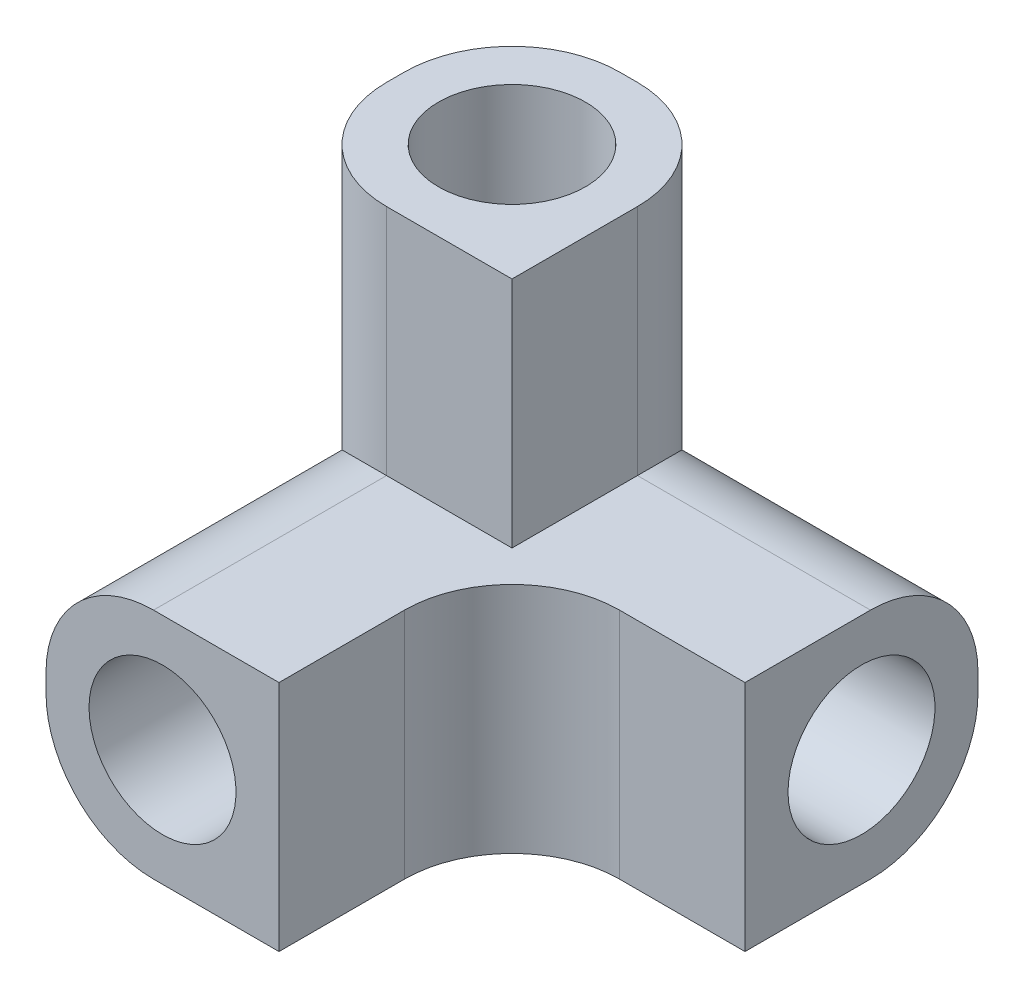
ISO-10303-21;
HEADER;
FILE_DESCRIPTION(('STEP AP214'),'2;1');
FILE_NAME('part.step','',(''),(''),'','','');
FILE_SCHEMA(('AUTOMOTIVE_DESIGN { 1 0 10303 214 1 1 1 1 }'));
ENDSEC;
DATA;
#1=APPLICATION_CONTEXT('core data for automotive mechanical design processes');
#2=APPLICATION_PROTOCOL_DEFINITION('international standard','automotive_design',2000,#1);
#3=PRODUCT_CONTEXT('',#1,'mechanical');
#4=PRODUCT('Part','Part','',(#3));
#5=PRODUCT_RELATED_PRODUCT_CATEGORY('part','',(#4));
#6=PRODUCT_DEFINITION_FORMATION('','',#4);
#7=PRODUCT_DEFINITION_CONTEXT('part definition',#1,'design');
#8=PRODUCT_DEFINITION('design','',#6,#7);
#9=PRODUCT_DEFINITION_SHAPE('','',#8);
#10=(LENGTH_UNIT() NAMED_UNIT(*) SI_UNIT(.MILLI.,.METRE.));
#11=(NAMED_UNIT(*) PLANE_ANGLE_UNIT() SI_UNIT($,.RADIAN.));
#12=(NAMED_UNIT(*) SI_UNIT($,.STERADIAN.) SOLID_ANGLE_UNIT());
#13=UNCERTAINTY_MEASURE_WITH_UNIT(LENGTH_MEASURE(1.E-05),#10,'distance_accuracy_value','');
#14=(GEOMETRIC_REPRESENTATION_CONTEXT(3) GLOBAL_UNCERTAINTY_ASSIGNED_CONTEXT((#13)) GLOBAL_UNIT_ASSIGNED_CONTEXT((#10,
#11,#12)) REPRESENTATION_CONTEXT('',''));
#15=CARTESIAN_POINT('',(0.,0.,0.));
#16=DIRECTION('',(0.,0.,1.));
#17=DIRECTION('',(1.,0.,0.));
#18=AXIS2_PLACEMENT_3D('',#15,#16,#17);
#19=CARTESIAN_POINT('',(-5.33069470301595,8.03212896370819,6.5));
#20=DIRECTION('',(-1.,0.,0.));
#21=DIRECTION('',(0.,-1.,0.));
#22=AXIS2_PLACEMENT_3D('',#19,#20,#21);
#23=PLANE('',#22);
#24=DIRECTION('',(0.,0.,-1.));
#25=VECTOR('',#24,1.);
#26=CARTESIAN_POINT('',(-5.33069470301595,1.53212896370819,6.5));
#27=LINE('',#26,#25);
#28=CARTESIAN_POINT('',(-5.33069470301595,1.53212896370819,6.5));
#29=VERTEX_POINT('',#28);
#30=CARTESIAN_POINT('',(-5.33069470301595,1.53212896370819,3.));
#31=VERTEX_POINT('',#30);
#32=EDGE_CURVE('E200',#29,#31,#27,.T.);
#33=ORIENTED_EDGE('',*,*,#32,.T.);
#34=DIRECTION('',(0.,-1.,0.));
#35=VECTOR('',#34,1.);
#36=CARTESIAN_POINT('',(-5.33069470301595,8.03212896370819,3.));
#37=LINE('',#36,#35);
#38=CARTESIAN_POINT('',(-5.33069470301595,8.03212896370819,3.));
#39=VERTEX_POINT('',#38);
#40=EDGE_CURVE('E267',#31,#39,#37,.F.);
#41=ORIENTED_EDGE('',*,*,#40,.T.);
#42=DIRECTION('',(0.,0.,-1.));
#43=VECTOR('',#42,1.);
#44=CARTESIAN_POINT('',(-5.33069470301595,8.03212896370819,6.5));
#45=LINE('',#44,#43);
#46=CARTESIAN_POINT('',(-5.33069470301595,8.03212896370819,6.5));
#47=VERTEX_POINT('',#46);
#48=EDGE_CURVE('E204',#47,#39,#45,.T.);
#49=ORIENTED_EDGE('',*,*,#48,.F.);
#50=DIRECTION('',(0.,1.,0.));
#51=VECTOR('',#50,1.);
#52=CARTESIAN_POINT('',(-5.33069470301595,8.03212896370819,6.5));
#53=LINE('',#52,#51);
#54=EDGE_CURVE('E189',#29,#47,#53,.T.);
#55=ORIENTED_EDGE('',*,*,#54,.F.);
#56=EDGE_LOOP('',(#33,#41,#49,#55));
#57=FACE_BOUND('',#56,.T.);
#58=ADVANCED_FACE('F33',(#57),#23,.F.);
#59=CARTESIAN_POINT('',(0.,0.,6.5));
#60=DIRECTION('',(0.,0.,1.));
#61=DIRECTION('',(1.,0.,0.));
#62=AXIS2_PLACEMENT_3D('',#59,#60,#61);
#63=PLANE('',#62);
#64=DIRECTION('',(-1.,0.,0.));
#65=VECTOR('',#64,1.);
#66=CARTESIAN_POINT('',(-11.830694703016,8.03212896370819,6.5));
#67=LINE('',#66,#65);
#68=CARTESIAN_POINT('',(-8.83069470301595,8.03212896370819,6.5));
#69=VERTEX_POINT('',#68);
#70=EDGE_CURVE('E192',#47,#69,#67,.T.);
#71=ORIENTED_EDGE('',*,*,#70,.T.);
#72=CARTESIAN_POINT('',(-8.83069470301595,5.03212896370819,6.5));
#73=DIRECTION('',(0.,0.,1.));
#74=DIRECTION('',(1.,0.,0.));
#75=AXIS2_PLACEMENT_3D('',#72,#73,#74);
#76=CIRCLE('',#75,3.);
#77=CARTESIAN_POINT('',(-11.830694703016,5.03212896370819,6.5));
#78=VERTEX_POINT('',#77);
#79=EDGE_CURVE('E239',#69,#78,#76,.T.);
#80=ORIENTED_EDGE('',*,*,#79,.T.);
#81=DIRECTION('',(0.,-1.,0.));
#82=VECTOR('',#81,1.);
#83=CARTESIAN_POINT('',(-11.830694703016,8.03212896370819,6.5));
#84=LINE('',#83,#82);
#85=CARTESIAN_POINT('',(-11.830694703016,4.53212896370819,6.5));
#86=VERTEX_POINT('',#85);
#87=EDGE_CURVE('E195',#78,#86,#84,.T.);
#88=ORIENTED_EDGE('',*,*,#87,.T.);
#89=CARTESIAN_POINT('',(-8.83069470301595,4.53212896370819,6.5));
#90=DIRECTION('',(0.,0.,1.));
#91=DIRECTION('',(1.,0.,0.));
#92=AXIS2_PLACEMENT_3D('',#89,#90,#91);
#93=CIRCLE('',#92,3.);
#94=CARTESIAN_POINT('',(-8.83069470301595,1.53212896370819,6.5));
#95=VERTEX_POINT('',#94);
#96=EDGE_CURVE('E237',#86,#95,#93,.T.);
#97=ORIENTED_EDGE('',*,*,#96,.T.);
#98=DIRECTION('',(1.,0.,0.));
#99=VECTOR('',#98,1.);
#100=CARTESIAN_POINT('',(-11.830694703016,1.53212896370819,6.5));
#101=LINE('',#100,#99);
#102=EDGE_CURVE('E198',#95,#29,#101,.T.);
#103=ORIENTED_EDGE('',*,*,#102,.T.);
#104=ORIENTED_EDGE('',*,*,#54,.T.);
#105=EDGE_LOOP('',(#71,#80,#88,#97,#103,#104));
#106=FACE_BOUND('',#105,.T.);
#107=CARTESIAN_POINT('',(-8.58069470301595,4.78212896370819,6.5));
#108=DIRECTION('',(0.,0.,1.));
#109=DIRECTION('',(1.,0.,0.));
#110=AXIS2_PLACEMENT_3D('',#107,#108,#109);
#111=CIRCLE('',#110,2.05);
#112=CARTESIAN_POINT('',(-10.6306947030159,4.78212896370819,6.5));
#113=VERTEX_POINT('',#112);
#114=EDGE_CURVE('E183',#113,#113,#111,.T.);
#115=ORIENTED_EDGE('',*,*,#114,.F.);
#116=EDGE_LOOP('',(#115));
#117=FACE_BOUND('',#116,.T.);
#118=ADVANCED_FACE('F285',(#106,#117),#63,.T.);
#119=DIRECTION('',(0.,0.,1.));
#120=VECTOR('',#119,1.);
#121=CARTESIAN_POINT('',(-5.33069470301595,8.03212896370819,0.));
#122=LINE('',#121,#120);
#123=CARTESIAN_POINT('',(-5.33069470301595,8.03212896370819,-3.5));
#124=VERTEX_POINT('',#123);
#125=CARTESIAN_POINT('',(-5.33069470301595,8.03212896370819,0.));
#126=VERTEX_POINT('',#125);
#127=EDGE_CURVE('E159',#124,#126,#122,.T.);
#128=ORIENTED_EDGE('',*,*,#127,.F.);
#129=DIRECTION('',(0.,1.,0.));
#130=VECTOR('',#129,1.);
#131=CARTESIAN_POINT('',(-5.33069470301595,14.5321289637082,-3.5));
#132=LINE('',#131,#130);
#133=CARTESIAN_POINT('',(-5.33069470301595,14.5321289637082,-3.5));
#134=VERTEX_POINT('',#133);
#135=EDGE_CURVE('E207',#124,#134,#132,.T.);
#136=ORIENTED_EDGE('',*,*,#135,.T.);
#137=DIRECTION('',(0.,0.,1.));
#138=VECTOR('',#137,1.);
#139=CARTESIAN_POINT('',(-5.33069470301595,14.5321289637082,0.));
#140=LINE('',#139,#138);
#141=CARTESIAN_POINT('',(-5.33069470301595,14.5321289637082,0.));
#142=VERTEX_POINT('',#141);
#143=EDGE_CURVE('E167',#134,#142,#140,.T.);
#144=ORIENTED_EDGE('',*,*,#143,.T.);
#145=DIRECTION('',(0.,-1.,0.));
#146=VECTOR('',#145,1.);
#147=CARTESIAN_POINT('',(-5.33069470301595,1.53212896370819,0.));
#148=LINE('',#147,#146);
#149=EDGE_CURVE('E164',#142,#126,#148,.T.);
#150=ORIENTED_EDGE('',*,*,#149,.T.);
#151=EDGE_LOOP('',(#128,#136,#144,#150));
#152=FACE_BOUND('',#151,.T.);
#153=ADVANCED_FACE('F288',(#152),#23,.F.);
#154=CARTESIAN_POINT('',(-11.830694703016,8.03212896370819,6.5));
#155=DIRECTION('',(0.,-1.,0.));
#156=DIRECTION('',(0.,0.,-1.));
#157=AXIS2_PLACEMENT_3D('',#154,#155,#156);
#158=PLANE('',#157);
#159=DIRECTION('',(-1.,0.,0.));
#160=VECTOR('',#159,1.);
#161=CARTESIAN_POINT('',(-11.830694703016,8.03212896370819,0.));
#162=LINE('',#161,#160);
#163=CARTESIAN_POINT('',(-8.83069470301595,8.03212896370819,0.));
#164=VERTEX_POINT('',#163);
#165=EDGE_CURVE('E186',#126,#164,#162,.T.);
#166=ORIENTED_EDGE('',*,*,#165,.T.);
#167=DIRECTION('',(0.,0.,-1.));
#168=VECTOR('',#167,1.);
#169=CARTESIAN_POINT('',(-8.83069470301595,8.03212896370819,6.5));
#170=LINE('',#169,#168);
#171=EDGE_CURVE('E235',#164,#69,#170,.F.);
#172=ORIENTED_EDGE('',*,*,#171,.T.);
#173=ORIENTED_EDGE('',*,*,#70,.F.);
#174=ORIENTED_EDGE('',*,*,#48,.T.);
#175=CARTESIAN_POINT('',(-2.33069470301595,8.03212896370819,3.));
#176=DIRECTION('',(0.,-1.,0.));
#177=DIRECTION('',(0.,0.,-1.));
#178=AXIS2_PLACEMENT_3D('',#175,#176,#177);
#179=CIRCLE('',#178,3.);
#180=CARTESIAN_POINT('',(-2.33069470301595,8.03212896370819,0.));
#181=VERTEX_POINT('',#180);
#182=EDGE_CURVE('E11',#39,#181,#179,.T.);
#183=ORIENTED_EDGE('',*,*,#182,.T.);
#184=DIRECTION('',(-1.,0.,0.));
#185=VECTOR('',#184,1.);
#186=CARTESIAN_POINT('',(1.16930529698405,8.03212896370819,0.));
#187=LINE('',#186,#185);
#188=CARTESIAN_POINT('',(1.16930529698405,8.03212896370819,0.));
#189=VERTEX_POINT('',#188);
#190=EDGE_CURVE('E48',#189,#181,#187,.T.);
#191=ORIENTED_EDGE('',*,*,#190,.F.);
#192=DIRECTION('',(0.,0.,1.));
#193=VECTOR('',#192,1.);
#194=CARTESIAN_POINT('',(1.16930529698405,8.03212896370819,0.));
#195=LINE('',#194,#193);
#196=CARTESIAN_POINT('',(1.16930529698405,8.03212896370819,-3.5));
#197=VERTEX_POINT('',#196);
#198=EDGE_CURVE('E158',#197,#189,#195,.T.);
#199=ORIENTED_EDGE('',*,*,#198,.F.);
#200=DIRECTION('',(-1.,0.,0.));
#201=VECTOR('',#200,1.);
#202=CARTESIAN_POINT('',(-5.33069470301595,8.03212896370819,-3.5));
#203=LINE('',#202,#201);
#204=EDGE_CURVE('E241',#197,#124,#203,.T.);
#205=ORIENTED_EDGE('',*,*,#204,.T.);
#206=ORIENTED_EDGE('',*,*,#127,.T.);
#207=EDGE_LOOP('',(#166,#172,#173,#174,#183,#191,#199,#205,#206));
#208=FACE_BOUND('',#207,.T.);
#209=ADVANCED_FACE('F275',(#208),#158,.F.);
#210=CARTESIAN_POINT('',(-11.830694703016,8.03212896370819,6.5));
#211=DIRECTION('',(1.,0.,0.));
#212=DIRECTION('',(0.,0.,-1.));
#213=AXIS2_PLACEMENT_3D('',#210,#211,#212);
#214=PLANE('',#213);
#215=DIRECTION('',(0.,0.,-1.));
#216=VECTOR('',#215,1.);
#217=CARTESIAN_POINT('',(-11.830694703016,5.03212896370819,6.5));
#218=LINE('',#217,#216);
#219=CARTESIAN_POINT('',(-11.830694703016,5.03212896370819,-3.));
#220=VERTEX_POINT('',#219);
#221=EDGE_CURVE('E228',#78,#220,#218,.T.);
#222=ORIENTED_EDGE('',*,*,#221,.T.);
#223=DIRECTION('',(0.,1.,0.));
#224=VECTOR('',#223,1.);
#225=CARTESIAN_POINT('',(-11.830694703016,14.5321289637082,-3.));
#226=LINE('',#225,#224);
#227=CARTESIAN_POINT('',(-11.830694703016,14.5321289637082,-3.));
#228=VERTEX_POINT('',#227);
#229=EDGE_CURVE('E230',#220,#228,#226,.T.);
#230=ORIENTED_EDGE('',*,*,#229,.T.);
#231=DIRECTION('',(0.,0.,-1.));
#232=VECTOR('',#231,1.);
#233=CARTESIAN_POINT('',(-11.830694703016,14.5321289637082,0.));
#234=LINE('',#233,#232);
#235=CARTESIAN_POINT('',(-11.830694703016,14.5321289637082,-3.5));
#236=VERTEX_POINT('',#235);
#237=EDGE_CURVE('E172',#228,#236,#234,.T.);
#238=ORIENTED_EDGE('',*,*,#237,.T.);
#239=DIRECTION('',(0.,-1.,0.));
#240=VECTOR('',#239,1.);
#241=CARTESIAN_POINT('',(-11.830694703016,1.53212896370819,-3.5));
#242=LINE('',#241,#240);
#243=CARTESIAN_POINT('',(-11.830694703016,4.53212896370819,-3.5));
#244=VERTEX_POINT('',#243);
#245=EDGE_CURVE('E224',#236,#244,#242,.T.);
#246=ORIENTED_EDGE('',*,*,#245,.T.);
#247=DIRECTION('',(0.,0.,-1.));
#248=VECTOR('',#247,1.);
#249=CARTESIAN_POINT('',(-11.830694703016,4.53212896370819,6.5));
#250=LINE('',#249,#248);
#251=EDGE_CURVE('E226',#244,#86,#250,.F.);
#252=ORIENTED_EDGE('',*,*,#251,.T.);
#253=ORIENTED_EDGE('',*,*,#87,.F.);
#254=EDGE_LOOP('',(#222,#230,#238,#246,#252,#253));
#255=FACE_BOUND('',#254,.T.);
#256=ADVANCED_FACE('F305',(#255),#214,.F.);
#257=CARTESIAN_POINT('',(-11.830694703016,1.53212896370819,6.5));
#258=DIRECTION('',(0.,1.,0.));
#259=DIRECTION('',(0.,0.,1.));
#260=AXIS2_PLACEMENT_3D('',#257,#258,#259);
#261=PLANE('',#260);
#262=DIRECTION('',(0.,0.,-1.));
#263=VECTOR('',#262,1.);
#264=CARTESIAN_POINT('',(-8.83069470301595,1.53212896370819,6.5));
#265=LINE('',#264,#263);
#266=CARTESIAN_POINT('',(-8.83069470301595,1.53212896370819,-3.5));
#267=VERTEX_POINT('',#266);
#268=EDGE_CURVE('E247',#95,#267,#265,.T.);
#269=ORIENTED_EDGE('',*,*,#268,.T.);
#270=DIRECTION('',(1.,0.,0.));
#271=VECTOR('',#270,1.);
#272=CARTESIAN_POINT('',(1.16930529698405,1.53212896370819,-3.5));
#273=LINE('',#272,#271);
#274=CARTESIAN_POINT('',(1.16930529698405,1.53212896370819,-3.5));
#275=VERTEX_POINT('',#274);
#276=EDGE_CURVE('E149',#267,#275,#273,.T.);
#277=ORIENTED_EDGE('',*,*,#276,.T.);
#278=DIRECTION('',(0.,0.,-1.));
#279=VECTOR('',#278,1.);
#280=CARTESIAN_POINT('',(1.16930529698405,1.53212896370819,0.));
#281=LINE('',#280,#279);
#282=CARTESIAN_POINT('',(1.16930529698405,1.53212896370819,0.));
#283=VERTEX_POINT('',#282);
#284=EDGE_CURVE('E143',#283,#275,#281,.T.);
#285=ORIENTED_EDGE('',*,*,#284,.F.);
#286=DIRECTION('',(-1.,0.,0.));
#287=VECTOR('',#286,1.);
#288=CARTESIAN_POINT('',(1.16930529698405,1.53212896370819,0.));
#289=LINE('',#288,#287);
#290=CARTESIAN_POINT('',(-2.33069470301595,1.53212896370819,0.));
#291=VERTEX_POINT('',#290);
#292=EDGE_CURVE('E147',#283,#291,#289,.T.);
#293=ORIENTED_EDGE('',*,*,#292,.T.);
#294=CARTESIAN_POINT('',(-2.33069470301595,1.53212896370819,3.));
#295=DIRECTION('',(0.,1.,0.));
#296=DIRECTION('',(0.,0.,1.));
#297=AXIS2_PLACEMENT_3D('',#294,#295,#296);
#298=CIRCLE('',#297,3.);
#299=EDGE_CURVE('E41',#291,#31,#298,.T.);
#300=ORIENTED_EDGE('',*,*,#299,.T.);
#301=ORIENTED_EDGE('',*,*,#32,.F.);
#302=ORIENTED_EDGE('',*,*,#102,.F.);
#303=EDGE_LOOP('',(#269,#277,#285,#293,#300,#301,#302));
#304=FACE_BOUND('',#303,.T.);
#305=ADVANCED_FACE('F145',(#304),#261,.F.);
#306=CARTESIAN_POINT('',(-8.58069470301595,4.78212896370819,6.5));
#307=DIRECTION('',(0.,0.,-1.));
#308=DIRECTION('',(-1.,0.,0.));
#309=AXIS2_PLACEMENT_3D('',#306,#307,#308);
#310=CYLINDRICAL_SURFACE('',#309,2.05);
#311=CARTESIAN_POINT('',(-8.58069470301595,4.78212896370819,0.));
#312=DIRECTION('',(0.,0.,1.));
#313=DIRECTION('',(1.,0.,0.));
#314=AXIS2_PLACEMENT_3D('',#311,#312,#313);
#315=CIRCLE('',#314,2.05);
#316=CARTESIAN_POINT('',(-10.6306947030159,4.78212896370819,0.));
#317=VERTEX_POINT('',#316);
#318=EDGE_CURVE('E174',#317,#317,#315,.T.);
#319=CARTESIAN_POINT('',(-10.6306947030159,4.78212896370819,6.5));
#320=CARTESIAN_POINT('',(-10.6306947030159,4.78212896370819,6.43229166666667));
#321=CARTESIAN_POINT('',(-10.6306947030159,4.78212896370819,6.36458333333333));
#322=CARTESIAN_POINT('',(-10.6306947030159,4.78212896370819,6.22916666666667));
#323=CARTESIAN_POINT('',(-10.6306947030159,4.78212896370819,6.16145833333333));
#324=CARTESIAN_POINT('',(-10.6306947030159,4.78212896370819,6.02604166666667));
#325=CARTESIAN_POINT('',(-10.6306947030159,4.78212896370819,5.95833333333333));
#326=CARTESIAN_POINT('',(-10.6306947030159,4.78212896370819,5.82291666666667));
#327=CARTESIAN_POINT('',(-10.6306947030159,4.78212896370819,5.75520833333333));
#328=CARTESIAN_POINT('',(-10.6306947030159,4.78212896370819,5.61979166666667));
#329=CARTESIAN_POINT('',(-10.6306947030159,4.78212896370819,5.55208333333333));
#330=CARTESIAN_POINT('',(-10.6306947030159,4.78212896370819,5.41666666666667));
#331=CARTESIAN_POINT('',(-10.6306947030159,4.78212896370819,5.34895833333333));
#332=CARTESIAN_POINT('',(-10.6306947030159,4.78212896370819,5.21354166666667));
#333=CARTESIAN_POINT('',(-10.6306947030159,4.78212896370819,5.14583333333333));
#334=CARTESIAN_POINT('',(-10.6306947030159,4.78212896370819,5.01041666666667));
#335=CARTESIAN_POINT('',(-10.6306947030159,4.78212896370819,4.94270833333333));
#336=CARTESIAN_POINT('',(-10.6306947030159,4.78212896370819,4.80729166666667));
#337=CARTESIAN_POINT('',(-10.6306947030159,4.78212896370819,4.73958333333333));
#338=CARTESIAN_POINT('',(-10.6306947030159,4.78212896370819,4.60416666666667));
#339=CARTESIAN_POINT('',(-10.6306947030159,4.78212896370819,4.53645833333333));
#340=CARTESIAN_POINT('',(-10.6306947030159,4.78212896370819,4.40104166666667));
#341=CARTESIAN_POINT('',(-10.6306947030159,4.78212896370819,4.33333333333333));
#342=CARTESIAN_POINT('',(-10.6306947030159,4.78212896370819,4.19791666666667));
#343=CARTESIAN_POINT('',(-10.6306947030159,4.78212896370819,4.13020833333333));
#344=CARTESIAN_POINT('',(-10.6306947030159,4.78212896370819,3.99479166666667));
#345=CARTESIAN_POINT('',(-10.6306947030159,4.78212896370819,3.92708333333333));
#346=CARTESIAN_POINT('',(-10.6306947030159,4.78212896370819,3.79166666666667));
#347=CARTESIAN_POINT('',(-10.6306947030159,4.78212896370819,3.72395833333333));
#348=CARTESIAN_POINT('',(-10.6306947030159,4.78212896370819,3.58854166666667));
#349=CARTESIAN_POINT('',(-10.6306947030159,4.78212896370819,3.52083333333333));
#350=CARTESIAN_POINT('',(-10.6306947030159,4.78212896370819,3.38541666666667));
#351=CARTESIAN_POINT('',(-10.6306947030159,4.78212896370819,3.31770833333333));
#352=CARTESIAN_POINT('',(-10.6306947030159,4.78212896370819,3.18229166666667));
#353=CARTESIAN_POINT('',(-10.6306947030159,4.78212896370819,3.11458333333333));
#354=CARTESIAN_POINT('',(-10.6306947030159,4.78212896370819,2.97916666666667));
#355=CARTESIAN_POINT('',(-10.6306947030159,4.78212896370819,2.91145833333333));
#356=CARTESIAN_POINT('',(-10.6306947030159,4.78212896370819,2.77604166666667));
#357=CARTESIAN_POINT('',(-10.6306947030159,4.78212896370819,2.70833333333333));
#358=CARTESIAN_POINT('',(-10.6306947030159,4.78212896370819,2.57291666666667));
#359=CARTESIAN_POINT('',(-10.6306947030159,4.78212896370819,2.50520833333333));
#360=CARTESIAN_POINT('',(-10.6306947030159,4.78212896370819,2.36979166666667));
#361=CARTESIAN_POINT('',(-10.6306947030159,4.78212896370819,2.30208333333333));
#362=CARTESIAN_POINT('',(-10.6306947030159,4.78212896370819,2.16666666666667));
#363=CARTESIAN_POINT('',(-10.6306947030159,4.78212896370819,2.09895833333333));
#364=CARTESIAN_POINT('',(-10.6306947030159,4.78212896370819,1.96354166666667));
#365=CARTESIAN_POINT('',(-10.6306947030159,4.78212896370819,1.89583333333333));
#366=CARTESIAN_POINT('',(-10.6306947030159,4.78212896370819,1.76041666666667));
#367=CARTESIAN_POINT('',(-10.6306947030159,4.78212896370819,1.69270833333333));
#368=CARTESIAN_POINT('',(-10.6306947030159,4.78212896370819,1.55729166666667));
#369=CARTESIAN_POINT('',(-10.6306947030159,4.78212896370819,1.48958333333333));
#370=CARTESIAN_POINT('',(-10.6306947030159,4.78212896370819,1.35416666666667));
#371=CARTESIAN_POINT('',(-10.6306947030159,4.78212896370819,1.28645833333333));
#372=CARTESIAN_POINT('',(-10.6306947030159,4.78212896370819,1.15104166666667));
#373=CARTESIAN_POINT('',(-10.6306947030159,4.78212896370819,1.08333333333333));
#374=CARTESIAN_POINT('',(-10.6306947030159,4.78212896370819,0.947916666666667));
#375=CARTESIAN_POINT('',(-10.6306947030159,4.78212896370819,0.880208333333333));
#376=CARTESIAN_POINT('',(-10.6306947030159,4.78212896370819,0.744791666666667));
#377=CARTESIAN_POINT('',(-10.6306947030159,4.78212896370819,0.677083333333333));
#378=CARTESIAN_POINT('',(-10.6306947030159,4.78212896370819,0.541666666666667));
#379=CARTESIAN_POINT('',(-10.6306947030159,4.78212896370819,0.473958333333333));
#380=CARTESIAN_POINT('',(-10.6306947030159,4.78212896370819,0.338541666666667));
#381=CARTESIAN_POINT('',(-10.6306947030159,4.78212896370819,0.270833333333334));
#382=CARTESIAN_POINT('',(-10.6306947030159,4.78212896370819,0.135416666666667));
#383=CARTESIAN_POINT('',(-10.6306947030159,4.78212896370819,0.0677083333333334));
#384=CARTESIAN_POINT('',(-10.6306947030159,4.78212896370819,0.));
#385=B_SPLINE_CURVE_WITH_KNOTS('',3,(#319,#320,#321,#322,#323,#324,#325,#326,#327,#328,#329,
#330,#331,#332,#333,#334,#335,#336,#337,#338,#339,#340,#341,#342,#343,#344,#345,#346,#347,#348,
#349,#350,#351,#352,#353,#354,#355,#356,#357,#358,#359,#360,#361,#362,#363,#364,#365,#366,#367,
#368,#369,#370,#371,#372,#373,#374,#375,#376,#377,#378,#379,#380,#381,#382,#383,#384),
.UNSPECIFIED.,.F.,.F.,(4,2,2,2,2,2,2,2,2,2,2,2,2,2,2,2,2,2,2,2,2,2,2,2,2,2,2,2,2,2,2,2,4),(0.,
0.203124999999999,0.40625,0.609375,0.812499999999999,1.015625,1.21875,1.421875,1.625,1.828125,
2.03125,2.234375,2.4375,2.640625,2.84375,3.046875,3.25,3.453125,3.65625,3.859375,4.0625,
4.265625,4.46875,4.671875,4.875,5.078125,5.28125,5.484375,5.6875,5.890625,6.09375,6.296875,6.5),.UNSPECIFIED.);
#386=EDGE_CURVE('BSEAM372',#113,#317,#385,.T.);
#387=ORIENTED_EDGE('',*,*,#114,.T.);
#388=ORIENTED_EDGE('',*,*,#318,.F.);
#389=ORIENTED_EDGE('',*,*,#386,.T.);
#390=ORIENTED_EDGE('',*,*,#386,.F.);
#391=EDGE_LOOP('',(#387,#389,#388,#390));
#392=FACE_BOUND('',#391,.T.);
#393=ADVANCED_FACE('F372',(#392),#310,.F.);
#394=CARTESIAN_POINT('',(-26.3651365567646,1.53212896370819,0.));
#395=DIRECTION('',(0.,0.,1.));
#396=DIRECTION('',(1.,0.,0.));
#397=AXIS2_PLACEMENT_3D('',#394,#395,#396);
#398=PLANE('',#397);
#399=ORIENTED_EDGE('',*,*,#318,.T.);
#400=EDGE_LOOP('',(#399));
#401=FACE_BOUND('',#400,.T.);
#402=ADVANCED_FACE('F366',(#401),#398,.T.);
#403=DIRECTION('',(1.,0.,0.));
#404=VECTOR('',#403,1.);
#405=CARTESIAN_POINT('',(-26.3651365567646,14.5321289637082,0.));
#406=LINE('',#405,#404);
#407=CARTESIAN_POINT('',(-8.83069470301595,14.5321289637082,0.));
#408=VERTEX_POINT('',#407);
#409=EDGE_CURVE('E175',#408,#142,#406,.T.);
#410=ORIENTED_EDGE('',*,*,#409,.F.);
#411=DIRECTION('',(0.,1.,0.));
#412=VECTOR('',#411,1.);
#413=CARTESIAN_POINT('',(-8.83069470301595,8.03212896370819,0.));
#414=LINE('',#413,#412);
#415=EDGE_CURVE('E233',#408,#164,#414,.F.);
#416=ORIENTED_EDGE('',*,*,#415,.T.);
#417=ORIENTED_EDGE('',*,*,#165,.F.);
#418=ORIENTED_EDGE('',*,*,#149,.F.);
#419=EDGE_LOOP('',(#410,#416,#417,#418));
#420=FACE_BOUND('',#419,.T.);
#421=ADVANCED_FACE('F359',(#420),#398,.T.);
#422=CARTESIAN_POINT('',(-26.3651365567646,14.5321289637082,0.));
#423=DIRECTION('',(0.,1.,0.));
#424=DIRECTION('',(0.,0.,1.));
#425=AXIS2_PLACEMENT_3D('',#422,#423,#424);
#426=PLANE('',#425);
#427=CARTESIAN_POINT('',(-8.58069470301595,14.5321289637082,-3.25));
#428=DIRECTION('',(0.,1.,0.));
#429=DIRECTION('',(0.,0.,1.));
#430=AXIS2_PLACEMENT_3D('',#427,#428,#429);
#431=CIRCLE('',#430,2.05);
#432=CARTESIAN_POINT('',(-8.58069470301595,14.5321289637082,-1.2));
#433=VERTEX_POINT('',#432);
#434=EDGE_CURVE('E253',#433,#433,#431,.T.);
#435=ORIENTED_EDGE('',*,*,#434,.F.);
#436=EDGE_LOOP('',(#435));
#437=FACE_BOUND('',#436,.T.);
#438=ORIENTED_EDGE('',*,*,#143,.F.);
#439=CARTESIAN_POINT('',(-8.33069470301595,14.5321289637082,-3.5));
#440=DIRECTION('',(0.,1.,0.));
#441=DIRECTION('',(0.,0.,1.));
#442=AXIS2_PLACEMENT_3D('',#439,#440,#441);
#443=CIRCLE('',#442,3.);
#444=CARTESIAN_POINT('',(-8.33069470301595,14.5321289637082,-6.5));
#445=VERTEX_POINT('',#444);
#446=EDGE_CURVE('E214',#134,#445,#443,.T.);
#447=ORIENTED_EDGE('',*,*,#446,.T.);
#448=DIRECTION('',(1.,0.,0.));
#449=VECTOR('',#448,1.);
#450=CARTESIAN_POINT('',(-26.3651365567646,14.5321289637082,-6.5));
#451=LINE('',#450,#449);
#452=CARTESIAN_POINT('',(-8.83069470301595,14.5321289637082,-6.5));
#453=VERTEX_POINT('',#452);
#454=EDGE_CURVE('E179',#453,#445,#451,.T.);
#455=ORIENTED_EDGE('',*,*,#454,.F.);
#456=CARTESIAN_POINT('',(-8.83069470301595,14.5321289637082,-3.5));
#457=DIRECTION('',(0.,1.,0.));
#458=DIRECTION('',(0.,0.,1.));
#459=AXIS2_PLACEMENT_3D('',#456,#457,#458);
#460=CIRCLE('',#459,3.);
#461=EDGE_CURVE('E210',#453,#236,#460,.T.);
#462=ORIENTED_EDGE('',*,*,#461,.T.);
#463=ORIENTED_EDGE('',*,*,#237,.F.);
#464=CARTESIAN_POINT('',(-8.83069470301595,14.5321289637082,-3.));
#465=DIRECTION('',(0.,1.,0.));
#466=DIRECTION('',(0.,0.,1.));
#467=AXIS2_PLACEMENT_3D('',#464,#465,#466);
#468=CIRCLE('',#467,3.);
#469=EDGE_CURVE('E212',#228,#408,#468,.T.);
#470=ORIENTED_EDGE('',*,*,#469,.T.);
#471=ORIENTED_EDGE('',*,*,#409,.T.);
#472=EDGE_LOOP('',(#438,#447,#455,#462,#463,#470,#471));
#473=FACE_BOUND('',#472,.T.);
#474=ADVANCED_FACE('F323',(#437,#473),#426,.T.);
#475=CARTESIAN_POINT('',(-26.3651365567646,1.53212896370819,-6.5));
#476=DIRECTION('',(0.,0.,-1.));
#477=DIRECTION('',(-1.,0.,0.));
#478=AXIS2_PLACEMENT_3D('',#475,#476,#477);
#479=PLANE('',#478);
#480=ORIENTED_EDGE('',*,*,#454,.T.);
#481=DIRECTION('',(0.,1.,0.));
#482=VECTOR('',#481,1.);
#483=CARTESIAN_POINT('',(-8.33069470301595,8.03212896370819,-6.5));
#484=LINE('',#483,#482);
#485=CARTESIAN_POINT('',(-8.33069470301595,5.03212896370819,-6.5));
#486=VERTEX_POINT('',#485);
#487=EDGE_CURVE('E222',#445,#486,#484,.F.);
#488=ORIENTED_EDGE('',*,*,#487,.T.);
#489=DIRECTION('',(-1.,0.,0.));
#490=VECTOR('',#489,1.);
#491=CARTESIAN_POINT('',(1.16930529698405,5.03212896370819,-6.5));
#492=LINE('',#491,#490);
#493=CARTESIAN_POINT('',(1.16930529698405,5.03212896370819,-6.5));
#494=VERTEX_POINT('',#493);
#495=EDGE_CURVE('E220',#486,#494,#492,.F.);
#496=ORIENTED_EDGE('',*,*,#495,.T.);
#497=DIRECTION('',(0.,1.,0.));
#498=VECTOR('',#497,1.);
#499=CARTESIAN_POINT('',(1.16930529698405,8.03212896370819,-6.5));
#500=LINE('',#499,#498);
#501=CARTESIAN_POINT('',(1.16930529698405,4.53212896370819,-6.5));
#502=VERTEX_POINT('',#501);
#503=EDGE_CURVE('E151',#502,#494,#500,.T.);
#504=ORIENTED_EDGE('',*,*,#503,.F.);
#505=DIRECTION('',(1.,0.,0.));
#506=VECTOR('',#505,1.);
#507=CARTESIAN_POINT('',(-11.830694703016,4.53212896370819,-6.5));
#508=LINE('',#507,#506);
#509=CARTESIAN_POINT('',(-8.83069470301595,4.53212896370819,-6.5));
#510=VERTEX_POINT('',#509);
#511=EDGE_CURVE('E218',#502,#510,#508,.F.);
#512=ORIENTED_EDGE('',*,*,#511,.T.);
#513=DIRECTION('',(0.,-1.,0.));
#514=VECTOR('',#513,1.);
#515=CARTESIAN_POINT('',(-8.83069470301595,14.5321289637082,-6.5));
#516=LINE('',#515,#514);
#517=EDGE_CURVE('E216',#510,#453,#516,.F.);
#518=ORIENTED_EDGE('',*,*,#517,.T.);
#519=EDGE_LOOP('',(#480,#488,#496,#504,#512,#518));
#520=FACE_BOUND('',#519,.T.);
#521=ADVANCED_FACE('F326',(#520),#479,.T.);
#522=CARTESIAN_POINT('',(1.16930529698405,0.,0.));
#523=DIRECTION('',(1.,0.,0.));
#524=DIRECTION('',(0.,0.,-1.));
#525=AXIS2_PLACEMENT_3D('',#522,#523,#524);
#526=PLANE('',#525);
#527=ORIENTED_EDGE('',*,*,#503,.T.);
#528=CARTESIAN_POINT('',(1.16930529698405,5.03212896370819,-3.5));
#529=DIRECTION('',(1.,0.,0.));
#530=DIRECTION('',(0.,0.,-1.));
#531=AXIS2_PLACEMENT_3D('',#528,#529,#530);
#532=CIRCLE('',#531,3.);
#533=EDGE_CURVE('E245',#494,#197,#532,.T.);
#534=ORIENTED_EDGE('',*,*,#533,.T.);
#535=ORIENTED_EDGE('',*,*,#198,.T.);
#536=DIRECTION('',(0.,-1.,0.));
#537=VECTOR('',#536,1.);
#538=CARTESIAN_POINT('',(1.16930529698405,8.03212896370819,0.));
#539=LINE('',#538,#537);
#540=EDGE_CURVE('E152',#189,#283,#539,.T.);
#541=ORIENTED_EDGE('',*,*,#540,.T.);
#542=ORIENTED_EDGE('',*,*,#284,.T.);
#543=CARTESIAN_POINT('',(1.16930529698405,4.53212896370819,-3.5));
#544=DIRECTION('',(1.,0.,0.));
#545=DIRECTION('',(0.,0.,-1.));
#546=AXIS2_PLACEMENT_3D('',#543,#544,#545);
#547=CIRCLE('',#546,3.);
#548=EDGE_CURVE('E243',#275,#502,#547,.T.);
#549=ORIENTED_EDGE('',*,*,#548,.T.);
#550=EDGE_LOOP('',(#527,#534,#535,#541,#542,#549));
#551=FACE_BOUND('',#550,.T.);
#552=CARTESIAN_POINT('',(1.16930529698405,4.78212896370819,-3.25));
#553=DIRECTION('',(1.,0.,0.));
#554=DIRECTION('',(0.,0.,-1.));
#555=AXIS2_PLACEMENT_3D('',#552,#553,#554);
#556=CIRCLE('',#555,2.05);
#557=CARTESIAN_POINT('',(1.16930529698405,4.78212896370819,-1.2));
#558=VERTEX_POINT('',#557);
#559=EDGE_CURVE('E312',#558,#558,#556,.T.);
#560=ORIENTED_EDGE('',*,*,#559,.F.);
#561=EDGE_LOOP('',(#560));
#562=FACE_BOUND('',#561,.T.);
#563=ADVANCED_FACE('F155',(#551,#562),#526,.T.);
#564=CARTESIAN_POINT('',(1.16930529698405,8.03212896370819,0.));
#565=DIRECTION('',(0.,0.,-1.));
#566=DIRECTION('',(0.,1.,0.));
#567=AXIS2_PLACEMENT_3D('',#564,#565,#566);
#568=PLANE('',#567);
#569=ORIENTED_EDGE('',*,*,#190,.T.);
#570=DIRECTION('',(0.,-1.,0.));
#571=VECTOR('',#570,1.);
#572=CARTESIAN_POINT('',(-2.33069470301595,1.53212896370819,0.));
#573=LINE('',#572,#571);
#574=EDGE_CURVE('E163',#181,#291,#573,.T.);
#575=ORIENTED_EDGE('',*,*,#574,.T.);
#576=ORIENTED_EDGE('',*,*,#292,.F.);
#577=ORIENTED_EDGE('',*,*,#540,.F.);
#578=EDGE_LOOP('',(#569,#575,#576,#577));
#579=FACE_BOUND('',#578,.T.);
#580=ADVANCED_FACE('F161',(#579),#568,.F.);
#581=CARTESIAN_POINT('',(1.16930529698405,4.78212896370819,-3.25));
#582=DIRECTION('',(-1.,0.,0.));
#583=DIRECTION('',(0.,0.,1.));
#584=AXIS2_PLACEMENT_3D('',#581,#582,#583);
#585=CYLINDRICAL_SURFACE('',#584,2.05);
#586=CARTESIAN_POINT('',(-5.33069470301595,4.78212896370819,-3.25));
#587=DIRECTION('',(1.,0.,0.));
#588=DIRECTION('',(0.,0.,-1.));
#589=AXIS2_PLACEMENT_3D('',#586,#587,#588);
#590=CIRCLE('',#589,2.05);
#591=CARTESIAN_POINT('',(-5.33069470301595,4.78212896370819,-1.2));
#592=VERTEX_POINT('',#591);
#593=EDGE_CURVE('E340',#592,#592,#590,.T.);
#594=CARTESIAN_POINT('',(1.16930529698405,4.78212896370819,-1.2));
#595=CARTESIAN_POINT('',(1.10159696365072,4.78212896370819,-1.2));
#596=CARTESIAN_POINT('',(1.03388863031738,4.78212896370819,-1.2));
#597=CARTESIAN_POINT('',(0.898471963650717,4.78212896370819,-1.2));
#598=CARTESIAN_POINT('',(0.830763630317383,4.78212896370819,-1.2));
#599=CARTESIAN_POINT('',(0.695346963650717,4.78212896370819,-1.2));
#600=CARTESIAN_POINT('',(0.627638630317383,4.78212896370819,-1.2));
#601=CARTESIAN_POINT('',(0.492221963650717,4.78212896370819,-1.2));
#602=CARTESIAN_POINT('',(0.424513630317383,4.78212896370819,-1.2));
#603=CARTESIAN_POINT('',(0.289096963650717,4.78212896370819,-1.2));
#604=CARTESIAN_POINT('',(0.221388630317383,4.78212896370819,-1.2));
#605=CARTESIAN_POINT('',(0.0859719636507166,4.78212896370819,-1.2));
#606=CARTESIAN_POINT('',(0.0182636303173832,4.78212896370819,-1.2));
#607=CARTESIAN_POINT('',(-0.117153036349284,4.78212896370819,-1.2));
#608=CARTESIAN_POINT('',(-0.184861369682617,4.78212896370819,-1.2));
#609=CARTESIAN_POINT('',(-0.320278036349283,4.78212896370819,-1.2));
#610=CARTESIAN_POINT('',(-0.387986369682617,4.78212896370819,-1.2));
#611=CARTESIAN_POINT('',(-0.523403036349283,4.78212896370819,-1.2));
#612=CARTESIAN_POINT('',(-0.591111369682617,4.78212896370819,-1.2));
#613=CARTESIAN_POINT('',(-0.726528036349283,4.78212896370819,-1.2));
#614=CARTESIAN_POINT('',(-0.794236369682616,4.78212896370819,-1.2));
#615=CARTESIAN_POINT('',(-0.929653036349283,4.78212896370819,-1.2));
#616=CARTESIAN_POINT('',(-0.997361369682616,4.78212896370819,-1.2));
#617=CARTESIAN_POINT('',(-1.13277803634928,4.78212896370819,-1.2));
#618=CARTESIAN_POINT('',(-1.20048636968262,4.78212896370819,-1.2));
#619=CARTESIAN_POINT('',(-1.33590303634928,4.78212896370819,-1.2));
#620=CARTESIAN_POINT('',(-1.40361136968262,4.78212896370819,-1.2));
#621=CARTESIAN_POINT('',(-1.53902803634928,4.78212896370819,-1.2));
#622=CARTESIAN_POINT('',(-1.60673636968262,4.78212896370819,-1.2));
#623=CARTESIAN_POINT('',(-1.74215303634928,4.78212896370819,-1.2));
#624=CARTESIAN_POINT('',(-1.80986136968262,4.78212896370819,-1.2));
#625=CARTESIAN_POINT('',(-1.94527803634928,4.78212896370819,-1.2));
#626=CARTESIAN_POINT('',(-2.01298636968262,4.78212896370819,-1.2));
#627=CARTESIAN_POINT('',(-2.14840303634928,4.78212896370819,-1.2));
#628=CARTESIAN_POINT('',(-2.21611136968262,4.78212896370819,-1.2));
#629=CARTESIAN_POINT('',(-2.35152803634928,4.78212896370819,-1.2));
#630=CARTESIAN_POINT('',(-2.41923636968262,4.78212896370819,-1.2));
#631=CARTESIAN_POINT('',(-2.55465303634928,4.78212896370819,-1.2));
#632=CARTESIAN_POINT('',(-2.62236136968262,4.78212896370819,-1.2));
#633=CARTESIAN_POINT('',(-2.75777803634928,4.78212896370819,-1.2));
#634=CARTESIAN_POINT('',(-2.82548636968262,4.78212896370819,-1.2));
#635=CARTESIAN_POINT('',(-2.96090303634928,4.78212896370819,-1.2));
#636=CARTESIAN_POINT('',(-3.02861136968262,4.78212896370819,-1.2));
#637=CARTESIAN_POINT('',(-3.16402803634928,4.78212896370819,-1.2));
#638=CARTESIAN_POINT('',(-3.23173636968262,4.78212896370819,-1.2));
#639=CARTESIAN_POINT('',(-3.36715303634928,4.78212896370819,-1.2));
#640=CARTESIAN_POINT('',(-3.43486136968262,4.78212896370819,-1.2));
#641=CARTESIAN_POINT('',(-3.57027803634928,4.78212896370819,-1.2));
#642=CARTESIAN_POINT('',(-3.63798636968262,4.78212896370819,-1.2));
#643=CARTESIAN_POINT('',(-3.77340303634928,4.78212896370819,-1.2));
#644=CARTESIAN_POINT('',(-3.84111136968262,4.78212896370819,-1.2));
#645=CARTESIAN_POINT('',(-3.97652803634928,4.78212896370819,-1.2));
#646=CARTESIAN_POINT('',(-4.04423636968262,4.78212896370819,-1.2));
#647=CARTESIAN_POINT('',(-4.17965303634928,4.78212896370819,-1.2));
#648=CARTESIAN_POINT('',(-4.24736136968262,4.78212896370819,-1.2));
#649=CARTESIAN_POINT('',(-4.38277803634928,4.78212896370819,-1.2));
#650=CARTESIAN_POINT('',(-4.45048636968262,4.78212896370819,-1.2));
#651=CARTESIAN_POINT('',(-4.58590303634928,4.78212896370819,-1.2));
#652=CARTESIAN_POINT('',(-4.65361136968262,4.78212896370819,-1.2));
#653=CARTESIAN_POINT('',(-4.78902803634928,4.78212896370819,-1.2));
#654=CARTESIAN_POINT('',(-4.85673636968262,4.78212896370819,-1.2));
#655=CARTESIAN_POINT('',(-4.99215303634928,4.78212896370819,-1.2));
#656=CARTESIAN_POINT('',(-5.05986136968262,4.78212896370819,-1.2));
#657=CARTESIAN_POINT('',(-5.19527803634928,4.78212896370819,-1.2));
#658=CARTESIAN_POINT('',(-5.26298636968262,4.78212896370819,-1.2));
#659=CARTESIAN_POINT('',(-5.33069470301595,4.78212896370819,-1.2));
#660=B_SPLINE_CURVE_WITH_KNOTS('',3,(#594,#595,#596,#597,#598,#599,#600,#601,#602,#603,#604,
#605,#606,#607,#608,#609,#610,#611,#612,#613,#614,#615,#616,#617,#618,#619,#620,#621,#622,#623,
#624,#625,#626,#627,#628,#629,#630,#631,#632,#633,#634,#635,#636,#637,#638,#639,#640,#641,#642,
#643,#644,#645,#646,#647,#648,#649,#650,#651,#652,#653,#654,#655,#656,#657,#658,#659),
.UNSPECIFIED.,.F.,.F.,(4,2,2,2,2,2,2,2,2,2,2,2,2,2,2,2,2,2,2,2,2,2,2,2,2,2,2,2,2,2,2,2,4),(0.,
0.203125,0.40625,0.609375,0.8125,1.015625,1.21875,1.421875,1.625,1.828125,2.03125,2.234375,
2.4375,2.640625,2.84375,3.046875,3.25,3.453125,3.65625,3.859375,4.0625,4.265625,4.46875,
4.671875,4.875,5.078125,5.28125,5.484375,5.6875,5.890625,6.09375,6.296875,6.5),.UNSPECIFIED.);
#661=EDGE_CURVE('BSEAM298',#558,#592,#660,.T.);
#662=ORIENTED_EDGE('',*,*,#559,.T.);
#663=ORIENTED_EDGE('',*,*,#593,.F.);
#664=ORIENTED_EDGE('',*,*,#661,.T.);
#665=ORIENTED_EDGE('',*,*,#661,.F.);
#666=EDGE_LOOP('',(#662,#664,#663,#665));
#667=FACE_BOUND('',#666,.T.);
#668=ADVANCED_FACE('F298',(#667),#585,.F.);
#669=ORIENTED_EDGE('',*,*,#593,.T.);
#670=EDGE_LOOP('',(#669));
#671=FACE_BOUND('',#670,.T.);
#672=ADVANCED_FACE('F287',(#671),#23,.F.);
#673=CARTESIAN_POINT('',(-8.58069470301595,6.53212896370819,-3.25));
#674=DIRECTION('',(0.,1.,0.));
#675=DIRECTION('',(0.,0.,1.));
#676=AXIS2_PLACEMENT_3D('',#673,#674,#675);
#677=CYLINDRICAL_SURFACE('',#676,2.05);
#678=CARTESIAN_POINT('',(-8.58069470301595,6.53212896370819,-3.25));
#679=DIRECTION('',(0.,1.,0.));
#680=DIRECTION('',(0.,0.,1.));
#681=AXIS2_PLACEMENT_3D('',#678,#679,#680);
#682=CIRCLE('',#681,2.05);
#683=CARTESIAN_POINT('',(-8.58069470301595,6.53212896370819,-1.2));
#684=VERTEX_POINT('',#683);
#685=EDGE_CURVE('E343',#684,#684,#682,.T.);
#686=ORIENTED_EDGE('',*,*,#685,.F.);
#687=EDGE_LOOP('',(#686));
#688=FACE_BOUND('',#687,.T.);
#689=ORIENTED_EDGE('',*,*,#434,.T.);
#690=EDGE_LOOP('',(#689));
#691=FACE_BOUND('',#690,.T.);
#692=ADVANCED_FACE('F297',(#688,#691),#677,.F.);
#693=CARTESIAN_POINT('',(-8.58069470301595,6.53212896370819,-3.25));
#694=DIRECTION('',(0.,1.,0.));
#695=DIRECTION('',(0.,0.,1.));
#696=AXIS2_PLACEMENT_3D('',#693,#694,#695);
#697=PLANE('',#696);
#698=ORIENTED_EDGE('',*,*,#685,.T.);
#699=EDGE_LOOP('',(#698));
#700=FACE_BOUND('',#699,.T.);
#701=ADVANCED_FACE('F351',(#700),#697,.T.);
#702=CARTESIAN_POINT('',(1.16930529698405,5.03212896370819,-3.5));
#703=DIRECTION('',(1.,0.,0.));
#704=DIRECTION('',(0.,0.,-1.));
#705=AXIS2_PLACEMENT_3D('',#702,#703,#704);
#706=CYLINDRICAL_SURFACE('',#705,3.);
#707=ORIENTED_EDGE('',*,*,#533,.F.);
#708=ORIENTED_EDGE('',*,*,#495,.F.);
#709=CARTESIAN_POINT('',(-8.33069470301595,5.03212896370819,-3.5));
#710=DIRECTION('',(0.707106781186548,-0.707106781186547,0.));
#711=DIRECTION('',(-0.707106781186547,-0.707106781186548,0.));
#712=AXIS2_PLACEMENT_3D('',#709,#710,#711);
#713=ELLIPSE('',#712,4.24264068711928,3.);
#714=EDGE_CURVE('E250',#124,#486,#713,.F.);
#715=ORIENTED_EDGE('',*,*,#714,.F.);
#716=ORIENTED_EDGE('',*,*,#204,.F.);
#717=EDGE_LOOP('',(#707,#708,#715,#716));
#718=FACE_BOUND('',#717,.T.);
#719=ADVANCED_FACE('F317',(#718),#706,.T.);
#720=CARTESIAN_POINT('',(-8.33069470301595,8.03212896370819,-3.5));
#721=DIRECTION('',(0.,-1.,0.));
#722=DIRECTION('',(1.,0.,0.));
#723=AXIS2_PLACEMENT_3D('',#720,#721,#722);
#724=CYLINDRICAL_SURFACE('',#723,3.);
#725=ORIENTED_EDGE('',*,*,#714,.T.);
#726=ORIENTED_EDGE('',*,*,#487,.F.);
#727=ORIENTED_EDGE('',*,*,#446,.F.);
#728=ORIENTED_EDGE('',*,*,#135,.F.);
#729=EDGE_LOOP('',(#725,#726,#727,#728));
#730=FACE_BOUND('',#729,.T.);
#731=ADVANCED_FACE('F320',(#730),#724,.T.);
#732=CARTESIAN_POINT('',(-8.83069470301595,5.03212896370819,6.5));
#733=DIRECTION('',(0.,0.,-1.));
#734=DIRECTION('',(-1.,0.,0.));
#735=AXIS2_PLACEMENT_3D('',#732,#733,#734);
#736=CYLINDRICAL_SURFACE('',#735,3.);
#737=ORIENTED_EDGE('',*,*,#79,.F.);
#738=ORIENTED_EDGE('',*,*,#171,.F.);
#739=CARTESIAN_POINT('',(-8.83069470301595,5.03212896370819,-3.));
#740=DIRECTION('',(0.,-0.707106781186547,0.707106781186547));
#741=DIRECTION('',(0.,-0.707106781186547,-0.707106781186547));
#742=AXIS2_PLACEMENT_3D('',#739,#740,#741);
#743=ELLIPSE('',#742,4.24264068711928,3.);
#744=EDGE_CURVE('E254',#220,#164,#743,.F.);
#745=ORIENTED_EDGE('',*,*,#744,.F.);
#746=ORIENTED_EDGE('',*,*,#221,.F.);
#747=EDGE_LOOP('',(#737,#738,#745,#746));
#748=FACE_BOUND('',#747,.T.);
#749=ADVANCED_FACE('F390',(#748),#736,.T.);
#750=CARTESIAN_POINT('',(-8.83069470301595,8.03212896370819,-3.));
#751=DIRECTION('',(0.,-1.,0.));
#752=DIRECTION('',(0.,0.,-1.));
#753=AXIS2_PLACEMENT_3D('',#750,#751,#752);
#754=CYLINDRICAL_SURFACE('',#753,3.);
#755=ORIENTED_EDGE('',*,*,#744,.T.);
#756=ORIENTED_EDGE('',*,*,#415,.F.);
#757=ORIENTED_EDGE('',*,*,#469,.F.);
#758=ORIENTED_EDGE('',*,*,#229,.F.);
#759=EDGE_LOOP('',(#755,#756,#757,#758));
#760=FACE_BOUND('',#759,.T.);
#761=ADVANCED_FACE('F393',(#760),#754,.T.);
#762=CARTESIAN_POINT('',(-8.83069470301595,8.03212896370819,-3.5));
#763=DIRECTION('',(0.,1.,0.));
#764=DIRECTION('',(0.,0.,1.));
#765=AXIS2_PLACEMENT_3D('',#762,#763,#764);
#766=CYLINDRICAL_SURFACE('',#765,3.);
#767=ORIENTED_EDGE('',*,*,#461,.F.);
#768=ORIENTED_EDGE('',*,*,#517,.F.);
#769=CARTESIAN_POINT('',(-8.83069470301595,4.53212896370819,-3.5));
#770=DIRECTION('',(0.,-1.,0.));
#771=DIRECTION('',(0.,0.,-1.));
#772=AXIS2_PLACEMENT_3D('',#769,#770,#771);
#773=CIRCLE('',#772,3.);
#774=EDGE_CURVE('E257',#244,#510,#773,.T.);
#775=ORIENTED_EDGE('',*,*,#774,.F.);
#776=ORIENTED_EDGE('',*,*,#245,.F.);
#777=EDGE_LOOP('',(#767,#768,#775,#776));
#778=FACE_BOUND('',#777,.T.);
#779=ADVANCED_FACE('F332',(#778),#766,.T.);
#780=CARTESIAN_POINT('',(-8.83069470301595,4.53212896370819,6.5));
#781=DIRECTION('',(0.,0.,-1.));
#782=DIRECTION('',(-1.,0.,0.));
#783=AXIS2_PLACEMENT_3D('',#780,#781,#782);
#784=CYLINDRICAL_SURFACE('',#783,3.);
#785=ORIENTED_EDGE('',*,*,#96,.F.);
#786=ORIENTED_EDGE('',*,*,#251,.F.);
#787=CARTESIAN_POINT('',(-8.83069470301595,4.53212896370819,-3.5));
#788=DIRECTION('',(0.,0.,-1.));
#789=DIRECTION('',(-1.,0.,0.));
#790=AXIS2_PLACEMENT_3D('',#787,#788,#789);
#791=CIRCLE('',#790,3.);
#792=EDGE_CURVE('E261',#267,#244,#791,.T.);
#793=ORIENTED_EDGE('',*,*,#792,.F.);
#794=ORIENTED_EDGE('',*,*,#268,.F.);
#795=EDGE_LOOP('',(#785,#786,#793,#794));
#796=FACE_BOUND('',#795,.T.);
#797=ADVANCED_FACE('F400',(#796),#784,.T.);
#798=CARTESIAN_POINT('',(-8.83069470301595,4.53212896370819,-3.5));
#799=DIRECTION('',(0.,0.,1.));
#800=DIRECTION('',(1.,0.,0.));
#801=AXIS2_PLACEMENT_3D('',#798,#799,#800);
#802=SPHERICAL_SURFACE('',#801,3.);
#803=ORIENTED_EDGE('',*,*,#792,.T.);
#804=ORIENTED_EDGE('',*,*,#774,.T.);
#805=CARTESIAN_POINT('',(-8.83069470301595,4.53212896370819,-3.5));
#806=DIRECTION('',(-1.,0.,0.));
#807=DIRECTION('',(0.,0.,1.));
#808=AXIS2_PLACEMENT_3D('',#805,#806,#807);
#809=CIRCLE('',#808,3.);
#810=EDGE_CURVE('E258',#267,#510,#809,.F.);
#811=ORIENTED_EDGE('',*,*,#810,.F.);
#812=EDGE_LOOP('',(#803,#804,#811));
#813=FACE_BOUND('',#812,.T.);
#814=ADVANCED_FACE('F281',(#813),#802,.T.);
#815=CARTESIAN_POINT('',(-11.830694703016,4.53212896370819,-3.5));
#816=DIRECTION('',(-1.,0.,0.));
#817=DIRECTION('',(0.,0.,1.));
#818=AXIS2_PLACEMENT_3D('',#815,#816,#817);
#819=CYLINDRICAL_SURFACE('',#818,3.);
#820=ORIENTED_EDGE('',*,*,#810,.T.);
#821=ORIENTED_EDGE('',*,*,#511,.F.);
#822=ORIENTED_EDGE('',*,*,#548,.F.);
#823=ORIENTED_EDGE('',*,*,#276,.F.);
#824=EDGE_LOOP('',(#820,#821,#822,#823));
#825=FACE_BOUND('',#824,.T.);
#826=ADVANCED_FACE('F277',(#825),#819,.T.);
#827=CARTESIAN_POINT('',(-2.33069470301595,8.03212896370819,3.));
#828=DIRECTION('',(0.,1.,0.));
#829=DIRECTION('',(-1.,0.,0.));
#830=AXIS2_PLACEMENT_3D('',#827,#828,#829);
#831=CYLINDRICAL_SURFACE('',#830,3.);
#832=ORIENTED_EDGE('',*,*,#182,.F.);
#833=ORIENTED_EDGE('',*,*,#40,.F.);
#834=ORIENTED_EDGE('',*,*,#299,.F.);
#835=ORIENTED_EDGE('',*,*,#574,.F.);
#836=EDGE_LOOP('',(#832,#833,#834,#835));
#837=FACE_BOUND('',#836,.T.);
#838=ADVANCED_FACE('F35',(#837),#831,.F.);
#839=CLOSED_SHELL('',(#58,#118,#153,#209,#256,#305,#393,#402,#421,#474,#521,#563,#580,#668,#672,
#692,#701,#719,#731,#749,#761,#779,#797,#814,#826,#838));
#840=MANIFOLD_SOLID_BREP('B2',#839);
#841=ADVANCED_BREP_SHAPE_REPRESENTATION('',(#18,#840),#14);
#842=SHAPE_DEFINITION_REPRESENTATION(#9,#841);
ENDSEC;
END-ISO-10303-21;
